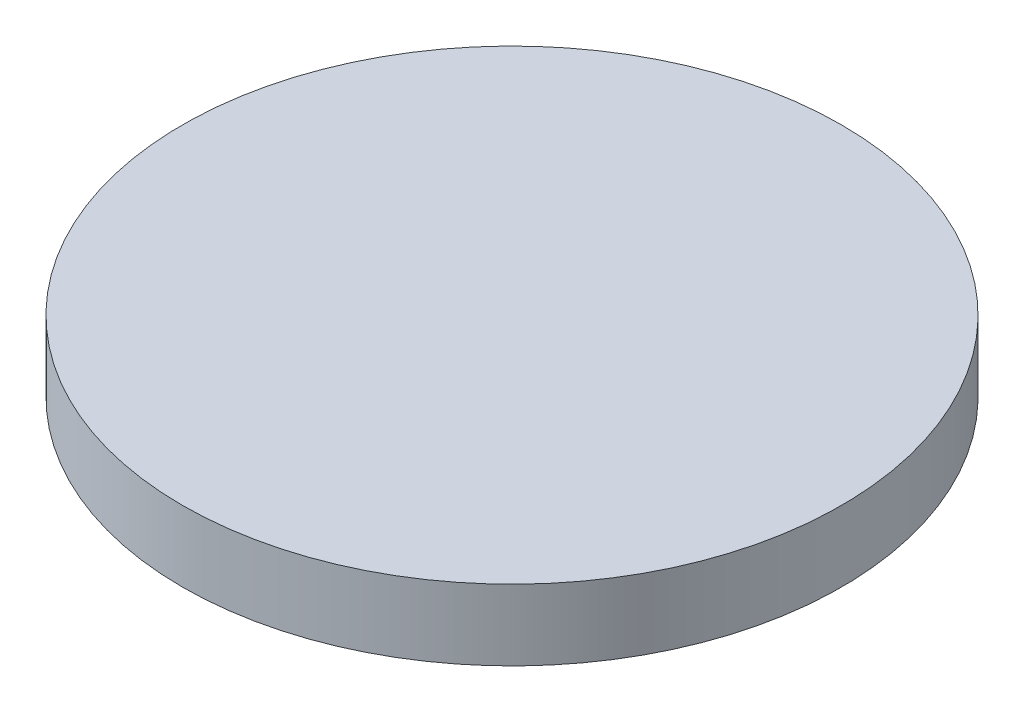
ISO-10303-21;
HEADER;
FILE_DESCRIPTION(('STEP AP214'),'2;1');
FILE_NAME('part.step','',(''),(''),'','','');
FILE_SCHEMA(('AUTOMOTIVE_DESIGN { 1 0 10303 214 1 1 1 1 }'));
ENDSEC;
DATA;
#1=APPLICATION_CONTEXT('core data for automotive mechanical design processes');
#2=APPLICATION_PROTOCOL_DEFINITION('international standard','automotive_design',2000,#1);
#3=PRODUCT_CONTEXT('',#1,'mechanical');
#4=PRODUCT('Part','Part','',(#3));
#5=PRODUCT_RELATED_PRODUCT_CATEGORY('part','',(#4));
#6=PRODUCT_DEFINITION_FORMATION('','',#4);
#7=PRODUCT_DEFINITION_CONTEXT('part definition',#1,'design');
#8=PRODUCT_DEFINITION('design','',#6,#7);
#9=PRODUCT_DEFINITION_SHAPE('','',#8);
#10=(LENGTH_UNIT() NAMED_UNIT(*) SI_UNIT(.MILLI.,.METRE.));
#11=(NAMED_UNIT(*) PLANE_ANGLE_UNIT() SI_UNIT($,.RADIAN.));
#12=(NAMED_UNIT(*) SI_UNIT($,.STERADIAN.) SOLID_ANGLE_UNIT());
#13=UNCERTAINTY_MEASURE_WITH_UNIT(LENGTH_MEASURE(1.E-05),#10,'distance_accuracy_value','');
#14=(GEOMETRIC_REPRESENTATION_CONTEXT(3) GLOBAL_UNCERTAINTY_ASSIGNED_CONTEXT((#13)) GLOBAL_UNIT_ASSIGNED_CONTEXT((#10,
#11,#12)) REPRESENTATION_CONTEXT('',''));
#15=CARTESIAN_POINT('',(0.,0.,0.));
#16=DIRECTION('',(0.,0.,1.));
#17=DIRECTION('',(1.,0.,0.));
#18=AXIS2_PLACEMENT_3D('',#15,#16,#17);
#19=CARTESIAN_POINT('',(0.,4.,0.));
#20=DIRECTION('',(0.,-1.,0.));
#21=DIRECTION('',(0.,0.,-1.));
#22=AXIS2_PLACEMENT_3D('',#19,#20,#21);
#23=CYLINDRICAL_SURFACE('',#22,18.62);
#24=CARTESIAN_POINT('',(0.,4.,0.));
#25=DIRECTION('',(0.,1.,0.));
#26=DIRECTION('',(0.,0.,1.));
#27=AXIS2_PLACEMENT_3D('',#24,#25,#26);
#28=CIRCLE('',#27,18.62);
#29=CARTESIAN_POINT('',(0.,4.,18.62));
#30=VERTEX_POINT('',#29);
#31=EDGE_CURVE('E10',#30,#30,#28,.T.);
#32=ORIENTED_EDGE('',*,*,#31,.F.);
#33=EDGE_LOOP('',(#32));
#34=FACE_BOUND('',#33,.T.);
#35=CARTESIAN_POINT('',(0.,0.,0.));
#36=DIRECTION('',(0.,1.,0.));
#37=DIRECTION('',(0.,0.,1.));
#38=AXIS2_PLACEMENT_3D('',#35,#36,#37);
#39=CIRCLE('',#38,18.62);
#40=CARTESIAN_POINT('',(0.,0.,18.62));
#41=VERTEX_POINT('',#40);
#42=EDGE_CURVE('E36',#41,#41,#39,.T.);
#43=ORIENTED_EDGE('',*,*,#42,.T.);
#44=EDGE_LOOP('',(#43));
#45=FACE_BOUND('',#44,.T.);
#46=ADVANCED_FACE('F33',(#34,#45),#23,.T.);
#47=CARTESIAN_POINT('',(0.,4.,0.));
#48=DIRECTION('',(0.,1.,0.));
#49=DIRECTION('',(0.,0.,1.));
#50=AXIS2_PLACEMENT_3D('',#47,#48,#49);
#51=PLANE('',#50);
#52=ORIENTED_EDGE('',*,*,#31,.T.);
#53=EDGE_LOOP('',(#52));
#54=FACE_BOUND('',#53,.T.);
#55=ADVANCED_FACE('F48',(#54),#51,.T.);
#56=CARTESIAN_POINT('',(0.,0.,0.));
#57=DIRECTION('',(0.,1.,0.));
#58=DIRECTION('',(0.,0.,1.));
#59=AXIS2_PLACEMENT_3D('',#56,#57,#58);
#60=PLANE('',#59);
#61=ORIENTED_EDGE('',*,*,#42,.F.);
#62=EDGE_LOOP('',(#61));
#63=FACE_BOUND('',#62,.T.);
#64=ADVANCED_FACE('F46',(#63),#60,.F.);
#65=CLOSED_SHELL('',(#46,#55,#64));
#66=MANIFOLD_SOLID_BREP('B2',#65);
#67=ADVANCED_BREP_SHAPE_REPRESENTATION('',(#18,#66),#14);
#68=SHAPE_DEFINITION_REPRESENTATION(#9,#67);
ENDSEC;
END-ISO-10303-21;
